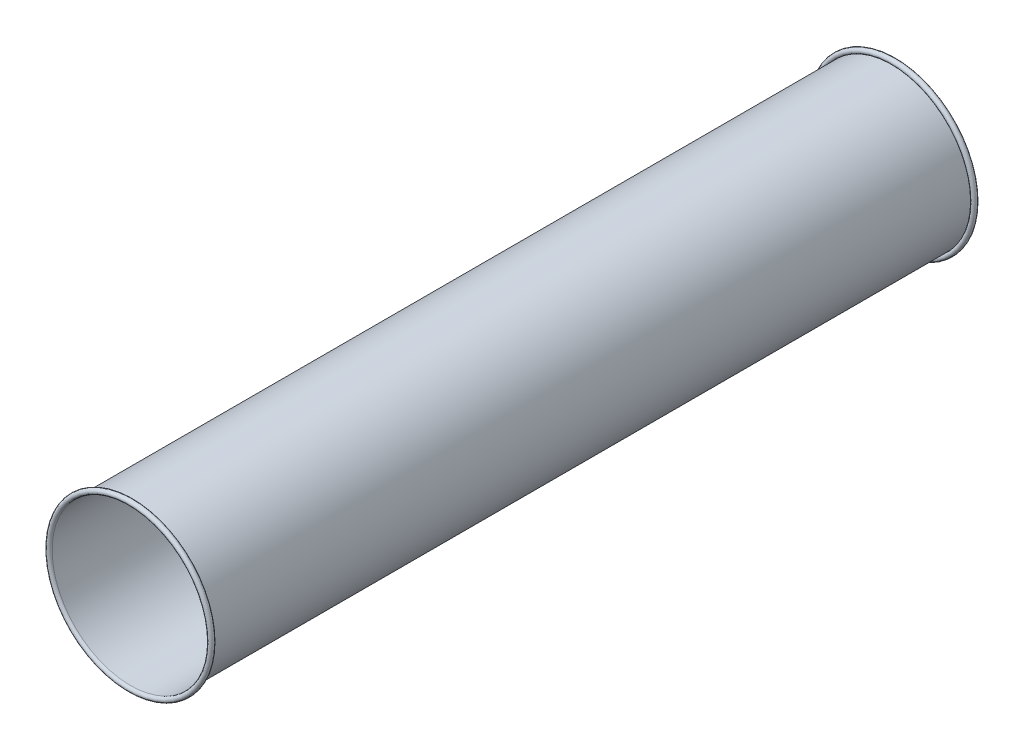
ISO-10303-21;
HEADER;
FILE_DESCRIPTION(('STEP AP214'),'2;1');
FILE_NAME('part.step','',(''),(''),'','','');
FILE_SCHEMA(('AUTOMOTIVE_DESIGN { 1 0 10303 214 1 1 1 1 }'));
ENDSEC;
DATA;
#1=APPLICATION_CONTEXT('core data for automotive mechanical design processes');
#2=APPLICATION_PROTOCOL_DEFINITION('international standard','automotive_design',2000,#1);
#3=PRODUCT_CONTEXT('',#1,'mechanical');
#4=PRODUCT('Part','Part','',(#3));
#5=PRODUCT_RELATED_PRODUCT_CATEGORY('part','',(#4));
#6=PRODUCT_DEFINITION_FORMATION('','',#4);
#7=PRODUCT_DEFINITION_CONTEXT('part definition',#1,'design');
#8=PRODUCT_DEFINITION('design','',#6,#7);
#9=PRODUCT_DEFINITION_SHAPE('','',#8);
#10=(LENGTH_UNIT() NAMED_UNIT(*) SI_UNIT(.MILLI.,.METRE.));
#11=(NAMED_UNIT(*) PLANE_ANGLE_UNIT() SI_UNIT($,.RADIAN.));
#12=(NAMED_UNIT(*) SI_UNIT($,.STERADIAN.) SOLID_ANGLE_UNIT());
#13=UNCERTAINTY_MEASURE_WITH_UNIT(LENGTH_MEASURE(1.E-05),#10,'distance_accuracy_value','');
#14=(GEOMETRIC_REPRESENTATION_CONTEXT(3) GLOBAL_UNCERTAINTY_ASSIGNED_CONTEXT((#13)) GLOBAL_UNIT_ASSIGNED_CONTEXT((#10,
#11,#12)) REPRESENTATION_CONTEXT('',''));
#15=CARTESIAN_POINT('',(0.,0.,0.));
#16=DIRECTION('',(0.,0.,1.));
#17=DIRECTION('',(1.,0.,0.));
#18=AXIS2_PLACEMENT_3D('',#15,#16,#17);
#19=CARTESIAN_POINT('',(0.,0.,746.125));
#20=DIRECTION('',(0.,0.,1.));
#21=DIRECTION('',(1.,0.,0.));
#22=AXIS2_PLACEMENT_3D('',#19,#20,#21);
#23=CYLINDRICAL_SURFACE('',#22,152.00376);
#24=CARTESIAN_POINT('',(0.,0.,741.045));
#25=DIRECTION('',(0.,0.,1.));
#26=DIRECTION('',(1.,0.,0.));
#27=AXIS2_PLACEMENT_3D('',#24,#25,#26);
#28=CIRCLE('',#27,152.00376);
#29=CARTESIAN_POINT('',(152.00376,0.,741.045));
#30=VERTEX_POINT('',#29);
#31=EDGE_CURVE('E10',#30,#30,#28,.T.);
#32=ORIENTED_EDGE('',*,*,#31,.T.);
#33=EDGE_LOOP('',(#32));
#34=FACE_BOUND('',#33,.T.);
#35=CARTESIAN_POINT('',(0.,0.,-741.045));
#36=DIRECTION('',(0.,0.,1.));
#37=DIRECTION('',(1.,0.,0.));
#38=AXIS2_PLACEMENT_3D('',#35,#36,#37);
#39=CIRCLE('',#38,152.00376);
#40=CARTESIAN_POINT('',(152.00376,0.,-741.045));
#41=VERTEX_POINT('',#40);
#42=EDGE_CURVE('E59',#41,#41,#39,.T.);
#43=ORIENTED_EDGE('',*,*,#42,.F.);
#44=EDGE_LOOP('',(#43));
#45=FACE_BOUND('',#44,.T.);
#46=ADVANCED_FACE('F39',(#34,#45),#23,.F.);
#47=CARTESIAN_POINT('',(0.,0.,741.045));
#48=DIRECTION('',(0.,0.,1.));
#49=DIRECTION('',(1.,0.,0.));
#50=AXIS2_PLACEMENT_3D('',#47,#48,#49);
#51=TOROIDAL_SURFACE('',#50,157.08376,5.07999999999999);
#52=ORIENTED_EDGE('',*,*,#31,.F.);
#53=EDGE_LOOP('',(#52));
#54=FACE_BOUND('',#53,.T.);
#55=CARTESIAN_POINT('',(0.,0.,737.75829986917));
#56=DIRECTION('',(0.,0.,1.));
#57=DIRECTION('',(1.,0.,0.));
#58=AXIS2_PLACEMENT_3D('',#55,#56,#57);
#59=CIRCLE('',#58,153.21026);
#60=CARTESIAN_POINT('',(153.21026,0.,737.75829986917));
#61=VERTEX_POINT('',#60);
#62=EDGE_CURVE('E44',#61,#61,#59,.T.);
#63=ORIENTED_EDGE('',*,*,#62,.T.);
#64=EDGE_LOOP('',(#63));
#65=FACE_BOUND('',#64,.T.);
#66=ADVANCED_FACE('F83',(#54,#65),#51,.T.);
#67=CARTESIAN_POINT('',(0.,0.,746.125));
#68=DIRECTION('',(0.,0.,1.));
#69=DIRECTION('',(1.,0.,0.));
#70=AXIS2_PLACEMENT_3D('',#67,#68,#69);
#71=CYLINDRICAL_SURFACE('',#70,153.21026);
#72=ORIENTED_EDGE('',*,*,#62,.F.);
#73=EDGE_LOOP('',(#72));
#74=FACE_BOUND('',#73,.T.);
#75=CARTESIAN_POINT('',(0.,0.,739.619428535639));
#76=DIRECTION('',(0.,0.,1.));
#77=DIRECTION('',(1.,0.,0.));
#78=AXIS2_PLACEMENT_3D('',#75,#76,#77);
#79=CIRCLE('',#78,153.21026);
#80=CARTESIAN_POINT('',(153.21026,0.,739.619428535639));
#81=VERTEX_POINT('',#80);
#82=EDGE_CURVE('E47',#81,#81,#79,.T.);
#83=ORIENTED_EDGE('',*,*,#82,.T.);
#84=EDGE_LOOP('',(#83));
#85=FACE_BOUND('',#84,.T.);
#86=ADVANCED_FACE('F92',(#74,#85),#71,.F.);
#87=CARTESIAN_POINT('',(0.,0.,741.045));
#88=DIRECTION('',(0.,0.,1.));
#89=DIRECTION('',(1.,0.,0.));
#90=AXIS2_PLACEMENT_3D('',#87,#88,#89);
#91=TOROIDAL_SURFACE('',#90,157.08376,4.12750000000001);
#92=ORIENTED_EDGE('',*,*,#82,.F.);
#93=EDGE_LOOP('',(#92));
#94=FACE_BOUND('',#93,.T.);
#95=CARTESIAN_POINT('',(0.,0.,741.045));
#96=DIRECTION('',(0.,0.,1.));
#97=DIRECTION('',(1.,0.,0.));
#98=AXIS2_PLACEMENT_3D('',#95,#96,#97);
#99=CIRCLE('',#98,152.95626);
#100=CARTESIAN_POINT('',(152.95626,0.,741.045));
#101=VERTEX_POINT('',#100);
#102=EDGE_CURVE('E52',#101,#101,#99,.T.);
#103=ORIENTED_EDGE('',*,*,#102,.T.);
#104=EDGE_LOOP('',(#103));
#105=FACE_BOUND('',#104,.T.);
#106=ADVANCED_FACE('F104',(#94,#105),#91,.F.);
#107=CARTESIAN_POINT('',(0.,0.,746.125));
#108=DIRECTION('',(0.,0.,1.));
#109=DIRECTION('',(1.,0.,0.));
#110=AXIS2_PLACEMENT_3D('',#107,#108,#109);
#111=CYLINDRICAL_SURFACE('',#110,152.95626);
#112=ORIENTED_EDGE('',*,*,#102,.F.);
#113=EDGE_LOOP('',(#112));
#114=FACE_BOUND('',#113,.T.);
#115=CARTESIAN_POINT('',(0.,0.,-741.045));
#116=DIRECTION('',(0.,0.,1.));
#117=DIRECTION('',(1.,0.,0.));
#118=AXIS2_PLACEMENT_3D('',#115,#116,#117);
#119=CIRCLE('',#118,152.95626);
#120=CARTESIAN_POINT('',(152.95626,0.,-741.045));
#121=VERTEX_POINT('',#120);
#122=EDGE_CURVE('E70',#121,#121,#119,.T.);
#123=ORIENTED_EDGE('',*,*,#122,.T.);
#124=EDGE_LOOP('',(#123));
#125=FACE_BOUND('',#124,.T.);
#126=ADVANCED_FACE('F74',(#114,#125),#111,.T.);
#127=CARTESIAN_POINT('',(0.,0.,-741.045));
#128=DIRECTION('',(0.,0.,-1.));
#129=DIRECTION('',(1.,0.,0.));
#130=AXIS2_PLACEMENT_3D('',#127,#128,#129);
#131=TOROIDAL_SURFACE('',#130,157.08376,5.07999999999999);
#132=ORIENTED_EDGE('',*,*,#42,.T.);
#133=EDGE_LOOP('',(#132));
#134=FACE_BOUND('',#133,.T.);
#135=CARTESIAN_POINT('',(0.,0.,-737.75829986917));
#136=DIRECTION('',(0.,0.,1.));
#137=DIRECTION('',(1.,0.,0.));
#138=AXIS2_PLACEMENT_3D('',#135,#136,#137);
#139=CIRCLE('',#138,153.21026);
#140=CARTESIAN_POINT('',(153.21026,0.,-737.75829986917));
#141=VERTEX_POINT('',#140);
#142=EDGE_CURVE('E62',#141,#141,#139,.T.);
#143=ORIENTED_EDGE('',*,*,#142,.F.);
#144=EDGE_LOOP('',(#143));
#145=FACE_BOUND('',#144,.T.);
#146=ADVANCED_FACE('F82',(#134,#145),#131,.T.);
#147=CARTESIAN_POINT('',(0.,0.,-746.125));
#148=DIRECTION('',(0.,0.,-1.));
#149=DIRECTION('',(1.,0.,0.));
#150=AXIS2_PLACEMENT_3D('',#147,#148,#149);
#151=CYLINDRICAL_SURFACE('',#150,153.21026);
#152=ORIENTED_EDGE('',*,*,#142,.T.);
#153=EDGE_LOOP('',(#152));
#154=FACE_BOUND('',#153,.T.);
#155=CARTESIAN_POINT('',(0.,0.,-739.619428535639));
#156=DIRECTION('',(0.,0.,1.));
#157=DIRECTION('',(1.,0.,0.));
#158=AXIS2_PLACEMENT_3D('',#155,#156,#157);
#159=CIRCLE('',#158,153.21026);
#160=CARTESIAN_POINT('',(153.21026,0.,-739.619428535639));
#161=VERTEX_POINT('',#160);
#162=EDGE_CURVE('E61',#161,#161,#159,.T.);
#163=ORIENTED_EDGE('',*,*,#162,.F.);
#164=EDGE_LOOP('',(#163));
#165=FACE_BOUND('',#164,.T.);
#166=ADVANCED_FACE('F72',(#154,#165),#151,.F.);
#167=CARTESIAN_POINT('',(0.,0.,-741.045));
#168=DIRECTION('',(0.,0.,-1.));
#169=DIRECTION('',(1.,0.,0.));
#170=AXIS2_PLACEMENT_3D('',#167,#168,#169);
#171=TOROIDAL_SURFACE('',#170,157.08376,4.12750000000001);
#172=ORIENTED_EDGE('',*,*,#162,.T.);
#173=EDGE_LOOP('',(#172));
#174=FACE_BOUND('',#173,.T.);
#175=ORIENTED_EDGE('',*,*,#122,.F.);
#176=EDGE_LOOP('',(#175));
#177=FACE_BOUND('',#176,.T.);
#178=ADVANCED_FACE('F75',(#174,#177),#171,.F.);
#179=CLOSED_SHELL('',(#46,#66,#86,#106,#126,#146,#166,#178));
#180=MANIFOLD_SOLID_BREP('B2',#179);
#181=ADVANCED_BREP_SHAPE_REPRESENTATION('',(#18,#180),#14);
#182=SHAPE_DEFINITION_REPRESENTATION(#9,#181);
ENDSEC;
END-ISO-10303-21;
